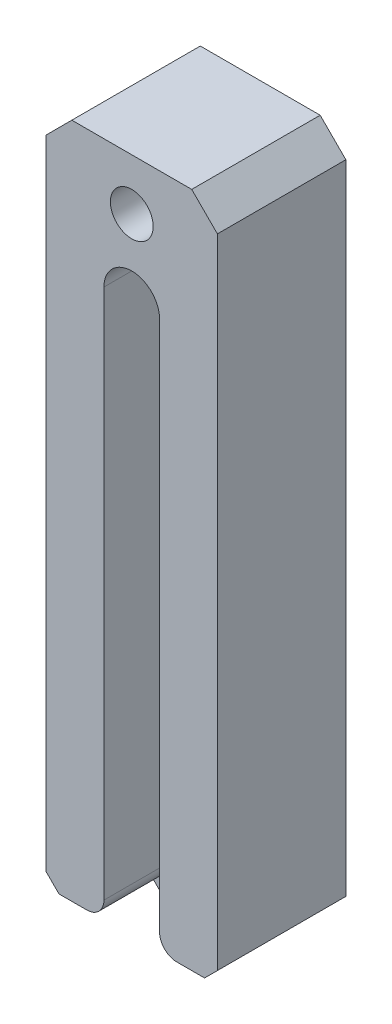
ISO-10303-21;
HEADER;
FILE_DESCRIPTION(('STEP AP214'),'2;1');
FILE_NAME('part.step','',(''),(''),'','','');
FILE_SCHEMA(('AUTOMOTIVE_DESIGN { 1 0 10303 214 1 1 1 1 }'));
ENDSEC;
DATA;
#1=APPLICATION_CONTEXT('core data for automotive mechanical design processes');
#2=APPLICATION_PROTOCOL_DEFINITION('international standard','automotive_design',2000,#1);
#3=PRODUCT_CONTEXT('',#1,'mechanical');
#4=PRODUCT('Part','Part','',(#3));
#5=PRODUCT_RELATED_PRODUCT_CATEGORY('part','',(#4));
#6=PRODUCT_DEFINITION_FORMATION('','',#4);
#7=PRODUCT_DEFINITION_CONTEXT('part definition',#1,'design');
#8=PRODUCT_DEFINITION('design','',#6,#7);
#9=PRODUCT_DEFINITION_SHAPE('','',#8);
#10=(LENGTH_UNIT() NAMED_UNIT(*) SI_UNIT(.MILLI.,.METRE.));
#11=(NAMED_UNIT(*) PLANE_ANGLE_UNIT() SI_UNIT($,.RADIAN.));
#12=(NAMED_UNIT(*) SI_UNIT($,.STERADIAN.) SOLID_ANGLE_UNIT());
#13=UNCERTAINTY_MEASURE_WITH_UNIT(LENGTH_MEASURE(1.E-05),#10,'distance_accuracy_value','');
#14=(GEOMETRIC_REPRESENTATION_CONTEXT(3) GLOBAL_UNCERTAINTY_ASSIGNED_CONTEXT((#13)) GLOBAL_UNIT_ASSIGNED_CONTEXT((#10,
#11,#12)) REPRESENTATION_CONTEXT('',''));
#15=CARTESIAN_POINT('',(0.,0.,0.));
#16=DIRECTION('',(0.,0.,1.));
#17=DIRECTION('',(1.,0.,0.));
#18=AXIS2_PLACEMENT_3D('',#15,#16,#17);
#19=CARTESIAN_POINT('',(10.,12.,0.));
#20=DIRECTION('',(0.,0.,1.));
#21=DIRECTION('',(1.,0.,0.));
#22=AXIS2_PLACEMENT_3D('',#19,#20,#21);
#23=CYLINDRICAL_SURFACE('',#22,3.25);
#24=CARTESIAN_POINT('',(10.,12.,6.));
#25=DIRECTION('',(0.,0.,1.));
#26=DIRECTION('',(1.,0.,0.));
#27=AXIS2_PLACEMENT_3D('',#24,#25,#26);
#28=CIRCLE('',#27,3.25);
#29=CARTESIAN_POINT('',(13.25,12.,6.));
#30=VERTEX_POINT('',#29);
#31=CARTESIAN_POINT('',(6.75,12.,6.));
#32=VERTEX_POINT('',#31);
#33=EDGE_CURVE('E160',#30,#32,#28,.F.);
#34=ORIENTED_EDGE('',*,*,#33,.F.);
#35=DIRECTION('',(0.,0.,1.));
#36=VECTOR('',#35,1.);
#37=CARTESIAN_POINT('',(13.25,12.,0.));
#38=LINE('',#37,#36);
#39=CARTESIAN_POINT('',(13.25,12.,0.));
#40=VERTEX_POINT('',#39);
#41=EDGE_CURVE('E198',#40,#30,#38,.T.);
#42=ORIENTED_EDGE('',*,*,#41,.F.);
#43=CARTESIAN_POINT('',(10.,12.,0.));
#44=DIRECTION('',(0.,0.,1.));
#45=DIRECTION('',(1.,0.,0.));
#46=AXIS2_PLACEMENT_3D('',#43,#44,#45);
#47=CIRCLE('',#46,3.25);
#48=CARTESIAN_POINT('',(6.75,12.,0.));
#49=VERTEX_POINT('',#48);
#50=EDGE_CURVE('E183',#49,#40,#47,.T.);
#51=ORIENTED_EDGE('',*,*,#50,.F.);
#52=DIRECTION('',(0.,0.,1.));
#53=VECTOR('',#52,1.);
#54=CARTESIAN_POINT('',(6.75,12.,0.));
#55=LINE('',#54,#53);
#56=EDGE_CURVE('E177',#49,#32,#55,.T.);
#57=ORIENTED_EDGE('',*,*,#56,.T.);
#58=EDGE_LOOP('',(#34,#42,#51,#57));
#59=FACE_BOUND('',#58,.T.);
#60=ADVANCED_FACE('F32',(#59),#23,.F.);
#61=CARTESIAN_POINT('',(0.,6.,6.));
#62=DIRECTION('',(0.,1.,0.));
#63=DIRECTION('',(0.,0.,1.));
#64=AXIS2_PLACEMENT_3D('',#61,#62,#63);
#65=PLANE('',#64);
#66=DIRECTION('',(-1.,0.,0.));
#67=VECTOR('',#66,1.);
#68=CARTESIAN_POINT('',(0.,6.,6.));
#69=LINE('',#68,#67);
#70=CARTESIAN_POINT('',(4.75,6.,6.));
#71=VERTEX_POINT('',#70);
#72=CARTESIAN_POINT('',(1.5,6.,6.));
#73=VERTEX_POINT('',#72);
#74=EDGE_CURVE('E288',#71,#73,#69,.T.);
#75=ORIENTED_EDGE('',*,*,#74,.F.);
#76=DIRECTION('',(0.,0.,1.));
#77=VECTOR('',#76,1.);
#78=CARTESIAN_POINT('',(4.75,6.,6.));
#79=LINE('',#78,#77);
#80=CARTESIAN_POINT('',(4.75,6.,15.));
#81=VERTEX_POINT('',#80);
#82=EDGE_CURVE('E229',#71,#81,#79,.T.);
#83=ORIENTED_EDGE('',*,*,#82,.T.);
#84=DIRECTION('',(-1.,0.,0.));
#85=VECTOR('',#84,1.);
#86=CARTESIAN_POINT('',(0.,6.,15.));
#87=LINE('',#86,#85);
#88=CARTESIAN_POINT('',(1.5,6.,15.));
#89=VERTEX_POINT('',#88);
#90=EDGE_CURVE('E285',#81,#89,#87,.T.);
#91=ORIENTED_EDGE('',*,*,#90,.T.);
#92=DIRECTION('',(0.,0.,-1.));
#93=VECTOR('',#92,1.);
#94=CARTESIAN_POINT('',(1.5,6.,6.));
#95=LINE('',#94,#93);
#96=EDGE_CURVE('E271',#89,#73,#95,.T.);
#97=ORIENTED_EDGE('',*,*,#96,.T.);
#98=EDGE_LOOP('',(#75,#83,#91,#97));
#99=FACE_BOUND('',#98,.T.);
#100=ADVANCED_FACE('F321',(#99),#65,.F.);
#101=CARTESIAN_POINT('',(0.,0.,15.));
#102=DIRECTION('',(1.,0.,0.));
#103=DIRECTION('',(0.,0.,-1.));
#104=AXIS2_PLACEMENT_3D('',#101,#102,#103);
#105=PLANE('',#104);
#106=DIRECTION('',(0.,-1.,0.));
#107=VECTOR('',#106,1.);
#108=CARTESIAN_POINT('',(0.,0.,15.));
#109=LINE('',#108,#107);
#110=CARTESIAN_POINT('',(0.,82.,15.));
#111=VERTEX_POINT('',#110);
#112=CARTESIAN_POINT('',(0.,7.5,15.));
#113=VERTEX_POINT('',#112);
#114=EDGE_CURVE('E201',#111,#113,#109,.T.);
#115=ORIENTED_EDGE('',*,*,#114,.F.);
#116=DIRECTION('',(0.,0.,-1.));
#117=VECTOR('',#116,1.);
#118=CARTESIAN_POINT('',(0.,82.,15.));
#119=LINE('',#118,#117);
#120=CARTESIAN_POINT('',(0.,82.,0.));
#121=VERTEX_POINT('',#120);
#122=EDGE_CURVE('E11',#111,#121,#119,.T.);
#123=ORIENTED_EDGE('',*,*,#122,.T.);
#124=DIRECTION('',(0.,-1.,0.));
#125=VECTOR('',#124,1.);
#126=CARTESIAN_POINT('',(0.,0.,0.));
#127=LINE('',#126,#125);
#128=CARTESIAN_POINT('',(0.,7.5,0.));
#129=VERTEX_POINT('',#128);
#130=EDGE_CURVE('E185',#121,#129,#127,.T.);
#131=ORIENTED_EDGE('',*,*,#130,.T.);
#132=DIRECTION('',(0.,0.,1.));
#133=VECTOR('',#132,1.);
#134=CARTESIAN_POINT('',(0.,7.5,0.));
#135=LINE('',#134,#133);
#136=EDGE_CURVE('E268',#129,#113,#135,.T.);
#137=ORIENTED_EDGE('',*,*,#136,.T.);
#138=EDGE_LOOP('',(#115,#123,#131,#137));
#139=FACE_BOUND('',#138,.T.);
#140=ADVANCED_FACE('F372',(#139),#105,.F.);
#141=CARTESIAN_POINT('',(0.,0.,15.));
#142=DIRECTION('',(0.,1.,0.));
#143=DIRECTION('',(0.,0.,1.));
#144=AXIS2_PLACEMENT_3D('',#141,#142,#143);
#145=PLANE('',#144);
#146=DIRECTION('',(1.,0.,0.));
#147=VECTOR('',#146,1.);
#148=CARTESIAN_POINT('',(0.,0.,0.));
#149=LINE('',#148,#147);
#150=CARTESIAN_POINT('',(7.5,0.,0.));
#151=VERTEX_POINT('',#150);
#152=CARTESIAN_POINT('',(12.5,0.,0.));
#153=VERTEX_POINT('',#152);
#154=EDGE_CURVE('E188',#151,#153,#149,.T.);
#155=ORIENTED_EDGE('',*,*,#154,.T.);
#156=DIRECTION('',(0.,0.,1.));
#157=VECTOR('',#156,1.);
#158=CARTESIAN_POINT('',(12.5,0.,0.));
#159=LINE('',#158,#157);
#160=CARTESIAN_POINT('',(12.5,0.,6.));
#161=VERTEX_POINT('',#160);
#162=EDGE_CURVE('E267',#153,#161,#159,.T.);
#163=ORIENTED_EDGE('',*,*,#162,.T.);
#164=DIRECTION('',(1.,0.,0.));
#165=VECTOR('',#164,1.);
#166=CARTESIAN_POINT('',(20.,0.,6.));
#167=LINE('',#166,#165);
#168=CARTESIAN_POINT('',(7.5,0.,6.));
#169=VERTEX_POINT('',#168);
#170=EDGE_CURVE('E286',#169,#161,#167,.T.);
#171=ORIENTED_EDGE('',*,*,#170,.F.);
#172=DIRECTION('',(0.,0.,1.));
#173=VECTOR('',#172,1.);
#174=CARTESIAN_POINT('',(7.5,0.,0.));
#175=LINE('',#174,#173);
#176=EDGE_CURVE('E274',#151,#169,#175,.T.);
#177=ORIENTED_EDGE('',*,*,#176,.F.);
#178=EDGE_LOOP('',(#155,#163,#171,#177));
#179=FACE_BOUND('',#178,.T.);
#180=ADVANCED_FACE('F341',(#179),#145,.F.);
#181=CARTESIAN_POINT('',(20.,0.,15.));
#182=DIRECTION('',(-1.,0.,0.));
#183=DIRECTION('',(0.,0.,1.));
#184=AXIS2_PLACEMENT_3D('',#181,#182,#183);
#185=PLANE('',#184);
#186=DIRECTION('',(0.,1.,0.));
#187=VECTOR('',#186,1.);
#188=CARTESIAN_POINT('',(20.,0.,0.));
#189=LINE('',#188,#187);
#190=CARTESIAN_POINT('',(20.,7.5,0.));
#191=VERTEX_POINT('',#190);
#192=CARTESIAN_POINT('',(20.,82.,0.));
#193=VERTEX_POINT('',#192);
#194=EDGE_CURVE('E211',#191,#193,#189,.T.);
#195=ORIENTED_EDGE('',*,*,#194,.T.);
#196=DIRECTION('',(0.,0.,1.));
#197=VECTOR('',#196,1.);
#198=CARTESIAN_POINT('',(20.,82.,15.));
#199=LINE('',#198,#197);
#200=CARTESIAN_POINT('',(20.,82.,15.));
#201=VERTEX_POINT('',#200);
#202=EDGE_CURVE('E55',#193,#201,#199,.T.);
#203=ORIENTED_EDGE('',*,*,#202,.T.);
#204=DIRECTION('',(0.,1.,0.));
#205=VECTOR('',#204,1.);
#206=CARTESIAN_POINT('',(20.,0.,15.));
#207=LINE('',#206,#205);
#208=CARTESIAN_POINT('',(20.,7.5,15.));
#209=VERTEX_POINT('',#208);
#210=EDGE_CURVE('E203',#209,#201,#207,.T.);
#211=ORIENTED_EDGE('',*,*,#210,.F.);
#212=DIRECTION('',(0.,0.,1.));
#213=VECTOR('',#212,1.);
#214=CARTESIAN_POINT('',(20.,7.5,0.));
#215=LINE('',#214,#213);
#216=EDGE_CURVE('E265',#191,#209,#215,.T.);
#217=ORIENTED_EDGE('',*,*,#216,.F.);
#218=EDGE_LOOP('',(#195,#203,#211,#217));
#219=FACE_BOUND('',#218,.T.);
#220=ADVANCED_FACE('F264',(#219),#185,.F.);
#221=CARTESIAN_POINT('',(0.,85.,15.));
#222=DIRECTION('',(0.,-1.,0.));
#223=DIRECTION('',(0.,0.,-1.));
#224=AXIS2_PLACEMENT_3D('',#221,#222,#223);
#225=PLANE('',#224);
#226=DIRECTION('',(-1.,0.,0.));
#227=VECTOR('',#226,1.);
#228=CARTESIAN_POINT('',(0.,85.,15.));
#229=LINE('',#228,#227);
#230=CARTESIAN_POINT('',(17.,85.,15.));
#231=VERTEX_POINT('',#230);
#232=CARTESIAN_POINT('',(3.,85.,15.));
#233=VERTEX_POINT('',#232);
#234=EDGE_CURVE('E206',#231,#233,#229,.T.);
#235=ORIENTED_EDGE('',*,*,#234,.F.);
#236=DIRECTION('',(0.,0.,-1.));
#237=VECTOR('',#236,1.);
#238=CARTESIAN_POINT('',(17.,85.,15.));
#239=LINE('',#238,#237);
#240=CARTESIAN_POINT('',(17.,85.,0.));
#241=VERTEX_POINT('',#240);
#242=EDGE_CURVE('E239',#231,#241,#239,.T.);
#243=ORIENTED_EDGE('',*,*,#242,.T.);
#244=DIRECTION('',(-1.,0.,0.));
#245=VECTOR('',#244,1.);
#246=CARTESIAN_POINT('',(0.,85.,0.));
#247=LINE('',#246,#245);
#248=CARTESIAN_POINT('',(3.,85.,0.));
#249=VERTEX_POINT('',#248);
#250=EDGE_CURVE('E204',#241,#249,#247,.T.);
#251=ORIENTED_EDGE('',*,*,#250,.T.);
#252=DIRECTION('',(0.,0.,1.));
#253=VECTOR('',#252,1.);
#254=CARTESIAN_POINT('',(3.,85.,15.));
#255=LINE('',#254,#253);
#256=EDGE_CURVE('E237',#249,#233,#255,.T.);
#257=ORIENTED_EDGE('',*,*,#256,.T.);
#258=EDGE_LOOP('',(#235,#243,#251,#257));
#259=FACE_BOUND('',#258,.T.);
#260=ADVANCED_FACE('F254',(#259),#225,.F.);
#261=CARTESIAN_POINT('',(0.,0.,15.));
#262=DIRECTION('',(0.,0.,-1.));
#263=DIRECTION('',(-1.,0.,0.));
#264=AXIS2_PLACEMENT_3D('',#261,#262,#263);
#265=PLANE('',#264);
#266=CARTESIAN_POINT('',(10.,79.,15.));
#267=DIRECTION('',(0.,0.,1.));
#268=DIRECTION('',(1.,0.,0.));
#269=AXIS2_PLACEMENT_3D('',#266,#267,#268);
#270=CIRCLE('',#269,2.5);
#271=CARTESIAN_POINT('',(12.5,79.,15.));
#272=VERTEX_POINT('',#271);
#273=EDGE_CURVE('E293',#272,#272,#270,.T.);
#274=ORIENTED_EDGE('',*,*,#273,.F.);
#275=EDGE_LOOP('',(#274));
#276=FACE_BOUND('',#275,.T.);
#277=ORIENTED_EDGE('',*,*,#210,.T.);
#278=DIRECTION('',(0.707106781186544,-0.707106781186551,0.));
#279=VECTOR('',#278,1.);
#280=CARTESIAN_POINT('',(17.,85.,15.));
#281=LINE('',#280,#279);
#282=EDGE_CURVE('E40',#201,#231,#281,.F.);
#283=ORIENTED_EDGE('',*,*,#282,.T.);
#284=ORIENTED_EDGE('',*,*,#234,.T.);
#285=DIRECTION('',(0.707106781186549,0.707106781186546,0.));
#286=VECTOR('',#285,1.);
#287=CARTESIAN_POINT('',(0.,82.,15.));
#288=LINE('',#287,#286);
#289=EDGE_CURVE('E47',#233,#111,#288,.F.);
#290=ORIENTED_EDGE('',*,*,#289,.T.);
#291=ORIENTED_EDGE('',*,*,#114,.T.);
#292=DIRECTION('',(-0.707106781186548,0.707106781186547,0.));
#293=VECTOR('',#292,1.);
#294=CARTESIAN_POINT('',(7.5,0.,15.));
#295=LINE('',#294,#293);
#296=EDGE_CURVE('E171',#89,#113,#295,.T.);
#297=ORIENTED_EDGE('',*,*,#296,.F.);
#298=ORIENTED_EDGE('',*,*,#90,.F.);
#299=CARTESIAN_POINT('',(4.75,8.,15.));
#300=DIRECTION('',(0.,0.,-1.));
#301=DIRECTION('',(-1.,0.,0.));
#302=AXIS2_PLACEMENT_3D('',#299,#300,#301);
#303=CIRCLE('',#302,2.);
#304=CARTESIAN_POINT('',(6.75,8.,15.));
#305=VERTEX_POINT('',#304);
#306=EDGE_CURVE('E223',#81,#305,#303,.F.);
#307=ORIENTED_EDGE('',*,*,#306,.T.);
#308=DIRECTION('',(0.,-1.,0.));
#309=VECTOR('',#308,1.);
#310=CARTESIAN_POINT('',(6.75,12.,15.));
#311=LINE('',#310,#309);
#312=CARTESIAN_POINT('',(6.75,70.,15.));
#313=VERTEX_POINT('',#312);
#314=EDGE_CURVE('E193',#313,#305,#311,.T.);
#315=ORIENTED_EDGE('',*,*,#314,.F.);
#316=CARTESIAN_POINT('',(10.,70.,15.));
#317=DIRECTION('',(0.,0.,1.));
#318=DIRECTION('',(1.,0.,0.));
#319=AXIS2_PLACEMENT_3D('',#316,#317,#318);
#320=CIRCLE('',#319,3.25);
#321=CARTESIAN_POINT('',(13.25,70.,15.));
#322=VERTEX_POINT('',#321);
#323=EDGE_CURVE('E310',#322,#313,#320,.T.);
#324=ORIENTED_EDGE('',*,*,#323,.F.);
#325=DIRECTION('',(0.,1.,0.));
#326=VECTOR('',#325,1.);
#327=CARTESIAN_POINT('',(13.25,12.,15.));
#328=LINE('',#327,#326);
#329=CARTESIAN_POINT('',(13.25,8.,15.));
#330=VERTEX_POINT('',#329);
#331=EDGE_CURVE('E299',#330,#322,#328,.T.);
#332=ORIENTED_EDGE('',*,*,#331,.F.);
#333=CARTESIAN_POINT('',(15.25,8.,15.));
#334=DIRECTION('',(0.,0.,-1.));
#335=DIRECTION('',(-1.,0.,0.));
#336=AXIS2_PLACEMENT_3D('',#333,#334,#335);
#337=CIRCLE('',#336,2.);
#338=CARTESIAN_POINT('',(15.25,6.,15.));
#339=VERTEX_POINT('',#338);
#340=EDGE_CURVE('E225',#330,#339,#337,.F.);
#341=ORIENTED_EDGE('',*,*,#340,.T.);
#342=CARTESIAN_POINT('',(18.5,6.,15.));
#343=VERTEX_POINT('',#342);
#344=EDGE_CURVE('E289',#343,#339,#87,.T.);
#345=ORIENTED_EDGE('',*,*,#344,.F.);
#346=DIRECTION('',(-0.707106781186548,-0.707106781186547,0.));
#347=VECTOR('',#346,1.);
#348=CARTESIAN_POINT('',(20.,7.5,15.));
#349=LINE('',#348,#347);
#350=EDGE_CURVE('E329',#209,#343,#349,.T.);
#351=ORIENTED_EDGE('',*,*,#350,.F.);
#352=EDGE_LOOP('',(#277,#283,#284,#290,#291,#297,#298,#307,#315,#324,#332,#341,#345,#351));
#353=FACE_BOUND('',#352,.T.);
#354=ADVANCED_FACE('F249',(#276,#353),#265,.F.);
#355=CARTESIAN_POINT('',(0.,0.,0.));
#356=DIRECTION('',(0.,0.,-1.));
#357=DIRECTION('',(-1.,0.,0.));
#358=AXIS2_PLACEMENT_3D('',#355,#356,#357);
#359=PLANE('',#358);
#360=ORIENTED_EDGE('',*,*,#250,.F.);
#361=DIRECTION('',(-0.707106781186544,0.707106781186551,0.));
#362=VECTOR('',#361,1.);
#363=CARTESIAN_POINT('',(51.0000000000001,50.9999999999996,0.));
#364=LINE('',#363,#362);
#365=EDGE_CURVE('E244',#241,#193,#364,.F.);
#366=ORIENTED_EDGE('',*,*,#365,.T.);
#367=ORIENTED_EDGE('',*,*,#194,.F.);
#368=DIRECTION('',(-0.707106781186548,-0.707106781186547,0.));
#369=VECTOR('',#368,1.);
#370=CARTESIAN_POINT('',(20.,7.5,0.));
#371=LINE('',#370,#369);
#372=EDGE_CURVE('E279',#191,#153,#371,.T.);
#373=ORIENTED_EDGE('',*,*,#372,.T.);
#374=ORIENTED_EDGE('',*,*,#154,.F.);
#375=DIRECTION('',(-0.707106781186548,0.707106781186547,0.));
#376=VECTOR('',#375,1.);
#377=CARTESIAN_POINT('',(7.5,0.,0.));
#378=LINE('',#377,#376);
#379=EDGE_CURVE('E331',#151,#129,#378,.T.);
#380=ORIENTED_EDGE('',*,*,#379,.T.);
#381=ORIENTED_EDGE('',*,*,#130,.F.);
#382=DIRECTION('',(-0.707106781186549,-0.707106781186546,0.));
#383=VECTOR('',#382,1.);
#384=CARTESIAN_POINT('',(-41.,41.0000000000002,0.));
#385=LINE('',#384,#383);
#386=EDGE_CURVE('E242',#121,#249,#385,.F.);
#387=ORIENTED_EDGE('',*,*,#386,.T.);
#388=EDGE_LOOP('',(#360,#366,#367,#373,#374,#380,#381,#387));
#389=FACE_BOUND('',#388,.T.);
#390=CARTESIAN_POINT('',(10.,79.,0.));
#391=DIRECTION('',(0.,0.,1.));
#392=DIRECTION('',(1.,0.,0.));
#393=AXIS2_PLACEMENT_3D('',#390,#391,#392);
#394=CIRCLE('',#393,2.5);
#395=CARTESIAN_POINT('',(12.5,79.,0.));
#396=VERTEX_POINT('',#395);
#397=EDGE_CURVE('E296',#396,#396,#394,.T.);
#398=ORIENTED_EDGE('',*,*,#397,.T.);
#399=EDGE_LOOP('',(#398));
#400=FACE_BOUND('',#399,.T.);
#401=ORIENTED_EDGE('',*,*,#50,.T.);
#402=DIRECTION('',(0.,1.,0.));
#403=VECTOR('',#402,1.);
#404=CARTESIAN_POINT('',(13.25,12.,0.));
#405=LINE('',#404,#403);
#406=CARTESIAN_POINT('',(13.25,70.,0.));
#407=VERTEX_POINT('',#406);
#408=EDGE_CURVE('E303',#40,#407,#405,.T.);
#409=ORIENTED_EDGE('',*,*,#408,.T.);
#410=CARTESIAN_POINT('',(10.,70.,0.));
#411=DIRECTION('',(0.,0.,1.));
#412=DIRECTION('',(1.,0.,0.));
#413=AXIS2_PLACEMENT_3D('',#410,#411,#412);
#414=CIRCLE('',#413,3.25);
#415=CARTESIAN_POINT('',(6.75,70.,0.));
#416=VERTEX_POINT('',#415);
#417=EDGE_CURVE('E306',#407,#416,#414,.T.);
#418=ORIENTED_EDGE('',*,*,#417,.T.);
#419=DIRECTION('',(0.,-1.,0.));
#420=VECTOR('',#419,1.);
#421=CARTESIAN_POINT('',(6.75,12.,0.));
#422=LINE('',#421,#420);
#423=EDGE_CURVE('E200',#416,#49,#422,.T.);
#424=ORIENTED_EDGE('',*,*,#423,.T.);
#425=EDGE_LOOP('',(#401,#409,#418,#424));
#426=FACE_BOUND('',#425,.T.);
#427=ADVANCED_FACE('F260',(#389,#400,#426),#359,.T.);
#428=CARTESIAN_POINT('',(6.75,12.,0.));
#429=DIRECTION('',(-1.,0.,0.));
#430=DIRECTION('',(0.,0.,1.));
#431=AXIS2_PLACEMENT_3D('',#428,#429,#430);
#432=PLANE('',#431);
#433=ORIENTED_EDGE('',*,*,#314,.T.);
#434=DIRECTION('',(0.,0.,1.));
#435=VECTOR('',#434,1.);
#436=CARTESIAN_POINT('',(6.75,8.,0.));
#437=LINE('',#436,#435);
#438=CARTESIAN_POINT('',(6.75,8.,6.));
#439=VERTEX_POINT('',#438);
#440=EDGE_CURVE('E180',#305,#439,#437,.F.);
#441=ORIENTED_EDGE('',*,*,#440,.T.);
#442=DIRECTION('',(0.,-1.,0.));
#443=VECTOR('',#442,1.);
#444=CARTESIAN_POINT('',(6.75,14.,6.));
#445=LINE('',#444,#443);
#446=EDGE_CURVE('E164',#32,#439,#445,.T.);
#447=ORIENTED_EDGE('',*,*,#446,.F.);
#448=ORIENTED_EDGE('',*,*,#56,.F.);
#449=ORIENTED_EDGE('',*,*,#423,.F.);
#450=DIRECTION('',(0.,0.,1.));
#451=VECTOR('',#450,1.);
#452=CARTESIAN_POINT('',(6.75,70.,0.));
#453=LINE('',#452,#451);
#454=EDGE_CURVE('E186',#416,#313,#453,.T.);
#455=ORIENTED_EDGE('',*,*,#454,.T.);
#456=EDGE_LOOP('',(#433,#441,#447,#448,#449,#455));
#457=FACE_BOUND('',#456,.T.);
#458=ADVANCED_FACE('F175',(#457),#432,.F.);
#459=CARTESIAN_POINT('',(10.,70.,0.));
#460=DIRECTION('',(0.,0.,1.));
#461=DIRECTION('',(1.,0.,0.));
#462=AXIS2_PLACEMENT_3D('',#459,#460,#461);
#463=CYLINDRICAL_SURFACE('',#462,3.25);
#464=ORIENTED_EDGE('',*,*,#323,.T.);
#465=ORIENTED_EDGE('',*,*,#454,.F.);
#466=ORIENTED_EDGE('',*,*,#417,.F.);
#467=DIRECTION('',(0.,0.,1.));
#468=VECTOR('',#467,1.);
#469=CARTESIAN_POINT('',(13.25,70.,0.));
#470=LINE('',#469,#468);
#471=EDGE_CURVE('E190',#407,#322,#470,.T.);
#472=ORIENTED_EDGE('',*,*,#471,.T.);
#473=EDGE_LOOP('',(#464,#465,#466,#472));
#474=FACE_BOUND('',#473,.T.);
#475=ADVANCED_FACE('F357',(#474),#463,.F.);
#476=CARTESIAN_POINT('',(13.25,12.,0.));
#477=DIRECTION('',(1.,0.,0.));
#478=DIRECTION('',(0.,0.,-1.));
#479=AXIS2_PLACEMENT_3D('',#476,#477,#478);
#480=PLANE('',#479);
#481=DIRECTION('',(0.,1.,0.));
#482=VECTOR('',#481,1.);
#483=CARTESIAN_POINT('',(13.25,14.,6.));
#484=LINE('',#483,#482);
#485=CARTESIAN_POINT('',(13.25,8.,6.));
#486=VERTEX_POINT('',#485);
#487=EDGE_CURVE('E167',#486,#30,#484,.T.);
#488=ORIENTED_EDGE('',*,*,#487,.F.);
#489=DIRECTION('',(0.,0.,1.));
#490=VECTOR('',#489,1.);
#491=CARTESIAN_POINT('',(13.25,8.,0.));
#492=LINE('',#491,#490);
#493=EDGE_CURVE('E220',#486,#330,#492,.T.);
#494=ORIENTED_EDGE('',*,*,#493,.T.);
#495=ORIENTED_EDGE('',*,*,#331,.T.);
#496=ORIENTED_EDGE('',*,*,#471,.F.);
#497=ORIENTED_EDGE('',*,*,#408,.F.);
#498=ORIENTED_EDGE('',*,*,#41,.T.);
#499=EDGE_LOOP('',(#488,#494,#495,#496,#497,#498));
#500=FACE_BOUND('',#499,.T.);
#501=ADVANCED_FACE('F352',(#500),#480,.F.);
#502=CARTESIAN_POINT('',(10.,79.,0.));
#503=DIRECTION('',(0.,0.,1.));
#504=DIRECTION('',(1.,0.,0.));
#505=AXIS2_PLACEMENT_3D('',#502,#503,#504);
#506=CYLINDRICAL_SURFACE('',#505,2.5);
#507=ORIENTED_EDGE('',*,*,#397,.F.);
#508=EDGE_LOOP('',(#507));
#509=FACE_BOUND('',#508,.T.);
#510=ORIENTED_EDGE('',*,*,#273,.T.);
#511=EDGE_LOOP('',(#510));
#512=FACE_BOUND('',#511,.T.);
#513=ADVANCED_FACE('F468',(#509,#512),#506,.F.);
#514=ORIENTED_EDGE('',*,*,#344,.T.);
#515=DIRECTION('',(0.,0.,1.));
#516=VECTOR('',#515,1.);
#517=CARTESIAN_POINT('',(15.25,6.,6.));
#518=LINE('',#517,#516);
#519=CARTESIAN_POINT('',(15.25,6.,6.));
#520=VERTEX_POINT('',#519);
#521=EDGE_CURVE('E227',#339,#520,#518,.F.);
#522=ORIENTED_EDGE('',*,*,#521,.T.);
#523=CARTESIAN_POINT('',(18.5,6.,6.));
#524=VERTEX_POINT('',#523);
#525=EDGE_CURVE('E290',#524,#520,#69,.T.);
#526=ORIENTED_EDGE('',*,*,#525,.F.);
#527=DIRECTION('',(0.,0.,1.));
#528=VECTOR('',#527,1.);
#529=CARTESIAN_POINT('',(18.5,6.,6.));
#530=LINE('',#529,#528);
#531=EDGE_CURVE('E282',#524,#343,#530,.T.);
#532=ORIENTED_EDGE('',*,*,#531,.T.);
#533=EDGE_LOOP('',(#514,#522,#526,#532));
#534=FACE_BOUND('',#533,.T.);
#535=ADVANCED_FACE('F345',(#534),#65,.F.);
#536=CARTESIAN_POINT('',(0.,0.,6.));
#537=DIRECTION('',(0.,0.,-1.));
#538=DIRECTION('',(-1.,0.,0.));
#539=AXIS2_PLACEMENT_3D('',#536,#537,#538);
#540=PLANE('',#539);
#541=ORIENTED_EDGE('',*,*,#170,.T.);
#542=DIRECTION('',(0.707106781186548,0.707106781186547,0.));
#543=VECTOR('',#542,1.);
#544=CARTESIAN_POINT('',(6.25,-6.25,6.));
#545=LINE('',#544,#543);
#546=EDGE_CURVE('E217',#161,#524,#545,.T.);
#547=ORIENTED_EDGE('',*,*,#546,.T.);
#548=ORIENTED_EDGE('',*,*,#525,.T.);
#549=CARTESIAN_POINT('',(15.25,8.,6.));
#550=DIRECTION('',(0.,0.,-1.));
#551=DIRECTION('',(-1.,0.,0.));
#552=AXIS2_PLACEMENT_3D('',#549,#550,#551);
#553=CIRCLE('',#552,2.);
#554=EDGE_CURVE('E233',#520,#486,#553,.T.);
#555=ORIENTED_EDGE('',*,*,#554,.T.);
#556=ORIENTED_EDGE('',*,*,#487,.T.);
#557=ORIENTED_EDGE('',*,*,#33,.T.);
#558=ORIENTED_EDGE('',*,*,#446,.T.);
#559=CARTESIAN_POINT('',(4.75,8.,6.));
#560=DIRECTION('',(0.,0.,-1.));
#561=DIRECTION('',(-1.,0.,0.));
#562=AXIS2_PLACEMENT_3D('',#559,#560,#561);
#563=CIRCLE('',#562,2.);
#564=EDGE_CURVE('E235',#439,#71,#563,.T.);
#565=ORIENTED_EDGE('',*,*,#564,.T.);
#566=ORIENTED_EDGE('',*,*,#74,.T.);
#567=DIRECTION('',(0.707106781186548,-0.707106781186547,0.));
#568=VECTOR('',#567,1.);
#569=CARTESIAN_POINT('',(3.75,3.75,6.));
#570=LINE('',#569,#568);
#571=EDGE_CURVE('E207',#73,#169,#570,.T.);
#572=ORIENTED_EDGE('',*,*,#571,.T.);
#573=EDGE_LOOP('',(#541,#547,#548,#555,#556,#557,#558,#565,#566,#572));
#574=FACE_BOUND('',#573,.T.);
#575=ADVANCED_FACE('F163',(#574),#540,.F.);
#576=CARTESIAN_POINT('',(7.5,0.,0.));
#577=DIRECTION('',(0.707106781186547,0.707106781186548,0.));
#578=DIRECTION('',(-0.707106781186548,0.707106781186547,0.));
#579=AXIS2_PLACEMENT_3D('',#576,#577,#578);
#580=PLANE('',#579);
#581=ORIENTED_EDGE('',*,*,#296,.T.);
#582=ORIENTED_EDGE('',*,*,#136,.F.);
#583=ORIENTED_EDGE('',*,*,#379,.F.);
#584=ORIENTED_EDGE('',*,*,#176,.T.);
#585=ORIENTED_EDGE('',*,*,#571,.F.);
#586=ORIENTED_EDGE('',*,*,#96,.F.);
#587=EDGE_LOOP('',(#581,#582,#583,#584,#585,#586));
#588=FACE_BOUND('',#587,.T.);
#589=ADVANCED_FACE('F327',(#588),#580,.F.);
#590=CARTESIAN_POINT('',(20.,7.5,0.));
#591=DIRECTION('',(-0.707106781186547,0.707106781186548,0.));
#592=DIRECTION('',(-0.707106781186548,-0.707106781186547,0.));
#593=AXIS2_PLACEMENT_3D('',#590,#591,#592);
#594=PLANE('',#593);
#595=ORIENTED_EDGE('',*,*,#546,.F.);
#596=ORIENTED_EDGE('',*,*,#162,.F.);
#597=ORIENTED_EDGE('',*,*,#372,.F.);
#598=ORIENTED_EDGE('',*,*,#216,.T.);
#599=ORIENTED_EDGE('',*,*,#350,.T.);
#600=ORIENTED_EDGE('',*,*,#531,.F.);
#601=EDGE_LOOP('',(#595,#596,#597,#598,#599,#600));
#602=FACE_BOUND('',#601,.T.);
#603=ADVANCED_FACE('F358',(#602),#594,.F.);
#604=CARTESIAN_POINT('',(15.25,8.,0.));
#605=DIRECTION('',(0.,0.,1.));
#606=DIRECTION('',(1.,0.,0.));
#607=AXIS2_PLACEMENT_3D('',#604,#605,#606);
#608=CYLINDRICAL_SURFACE('',#607,2.);
#609=ORIENTED_EDGE('',*,*,#554,.F.);
#610=ORIENTED_EDGE('',*,*,#521,.F.);
#611=ORIENTED_EDGE('',*,*,#340,.F.);
#612=ORIENTED_EDGE('',*,*,#493,.F.);
#613=EDGE_LOOP('',(#609,#610,#611,#612));
#614=FACE_BOUND('',#613,.T.);
#615=ADVANCED_FACE('F349',(#614),#608,.T.);
#616=CARTESIAN_POINT('',(4.75,8.,6.));
#617=DIRECTION('',(0.,0.,1.));
#618=DIRECTION('',(1.,0.,0.));
#619=AXIS2_PLACEMENT_3D('',#616,#617,#618);
#620=CYLINDRICAL_SURFACE('',#619,2.);
#621=ORIENTED_EDGE('',*,*,#564,.F.);
#622=ORIENTED_EDGE('',*,*,#440,.F.);
#623=ORIENTED_EDGE('',*,*,#306,.F.);
#624=ORIENTED_EDGE('',*,*,#82,.F.);
#625=EDGE_LOOP('',(#621,#622,#623,#624));
#626=FACE_BOUND('',#625,.T.);
#627=ADVANCED_FACE('F316',(#626),#620,.T.);
#628=CARTESIAN_POINT('',(17.,85.,15.));
#629=DIRECTION('',(-0.707106781186551,-0.707106781186544,0.));
#630=DIRECTION('',(0.,0.,-1.));
#631=AXIS2_PLACEMENT_3D('',#628,#629,#630);
#632=PLANE('',#631);
#633=ORIENTED_EDGE('',*,*,#282,.F.);
#634=ORIENTED_EDGE('',*,*,#202,.F.);
#635=ORIENTED_EDGE('',*,*,#365,.F.);
#636=ORIENTED_EDGE('',*,*,#242,.F.);
#637=EDGE_LOOP('',(#633,#634,#635,#636));
#638=FACE_BOUND('',#637,.T.);
#639=ADVANCED_FACE('F257',(#638),#632,.F.);
#640=CARTESIAN_POINT('',(0.,82.,15.));
#641=DIRECTION('',(0.707106781186546,-0.707106781186549,0.));
#642=DIRECTION('',(0.,0.,-1.));
#643=AXIS2_PLACEMENT_3D('',#640,#641,#642);
#644=PLANE('',#643);
#645=ORIENTED_EDGE('',*,*,#289,.F.);
#646=ORIENTED_EDGE('',*,*,#256,.F.);
#647=ORIENTED_EDGE('',*,*,#386,.F.);
#648=ORIENTED_EDGE('',*,*,#122,.F.);
#649=EDGE_LOOP('',(#645,#646,#647,#648));
#650=FACE_BOUND('',#649,.T.);
#651=ADVANCED_FACE('F34',(#650),#644,.F.);
#652=CLOSED_SHELL('',(#60,#100,#140,#180,#220,#260,#354,#427,#458,#475,#501,#513,#535,#575,#589,
#603,#615,#627,#639,#651));
#653=MANIFOLD_SOLID_BREP('B2',#652);
#654=ADVANCED_BREP_SHAPE_REPRESENTATION('',(#18,#653),#14);
#655=SHAPE_DEFINITION_REPRESENTATION(#9,#654);
ENDSEC;
END-ISO-10303-21;
